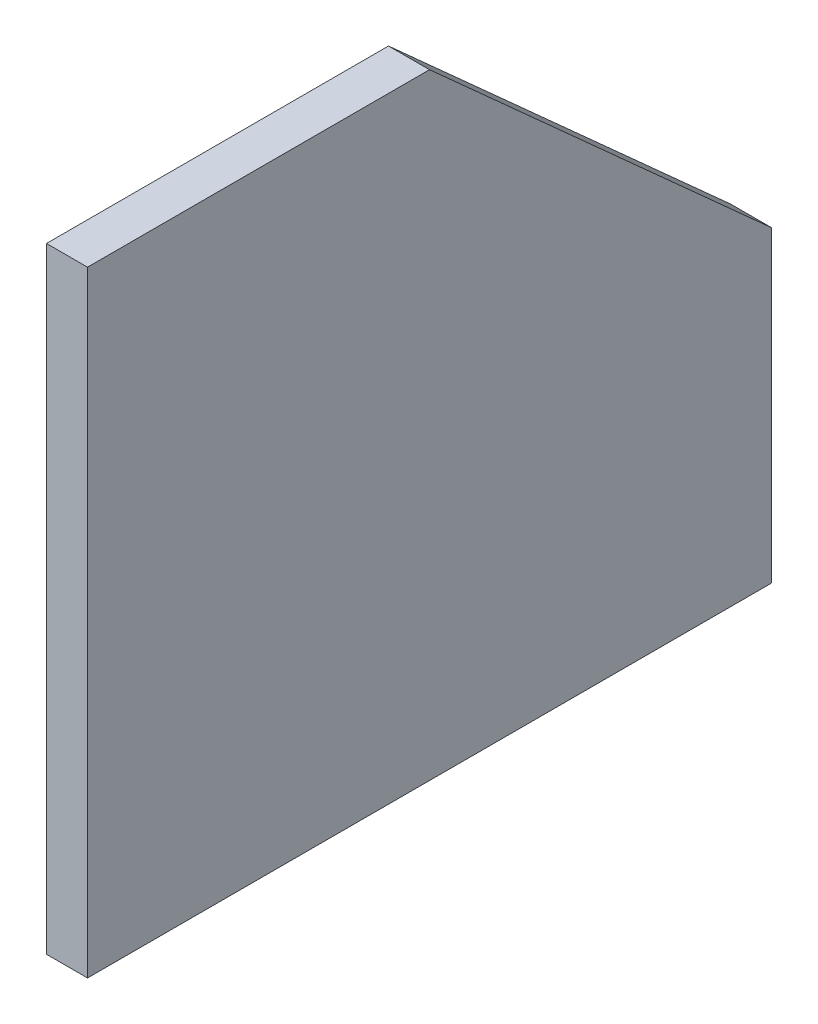
ISO-10303-21;
HEADER;
FILE_DESCRIPTION(('STEP AP214'),'2;1');
FILE_NAME('part.step','',(''),(''),'','','');
FILE_SCHEMA(('AUTOMOTIVE_DESIGN { 1 0 10303 214 1 1 1 1 }'));
ENDSEC;
DATA;
#1=APPLICATION_CONTEXT('core data for automotive mechanical design processes');
#2=APPLICATION_PROTOCOL_DEFINITION('international standard','automotive_design',2000,#1);
#3=PRODUCT_CONTEXT('',#1,'mechanical');
#4=PRODUCT('Part','Part','',(#3));
#5=PRODUCT_RELATED_PRODUCT_CATEGORY('part','',(#4));
#6=PRODUCT_DEFINITION_FORMATION('','',#4);
#7=PRODUCT_DEFINITION_CONTEXT('part definition',#1,'design');
#8=PRODUCT_DEFINITION('design','',#6,#7);
#9=PRODUCT_DEFINITION_SHAPE('','',#8);
#10=(LENGTH_UNIT() NAMED_UNIT(*) SI_UNIT(.MILLI.,.METRE.));
#11=(NAMED_UNIT(*) PLANE_ANGLE_UNIT() SI_UNIT($,.RADIAN.));
#12=(NAMED_UNIT(*) SI_UNIT($,.STERADIAN.) SOLID_ANGLE_UNIT());
#13=UNCERTAINTY_MEASURE_WITH_UNIT(LENGTH_MEASURE(1.E-05),#10,'distance_accuracy_value','');
#14=(GEOMETRIC_REPRESENTATION_CONTEXT(3) GLOBAL_UNCERTAINTY_ASSIGNED_CONTEXT((#13)) GLOBAL_UNIT_ASSIGNED_CONTEXT((#10,
#11,#12)) REPRESENTATION_CONTEXT('',''));
#15=CARTESIAN_POINT('',(0.,0.,0.));
#16=DIRECTION('',(0.,0.,1.));
#17=DIRECTION('',(1.,0.,0.));
#18=AXIS2_PLACEMENT_3D('',#15,#16,#17);
#19=CARTESIAN_POINT('',(-6.,0.,0.));
#20=DIRECTION('',(0.,0.,-1.));
#21=DIRECTION('',(0.,1.,0.));
#22=AXIS2_PLACEMENT_3D('',#19,#20,#21);
#23=PLANE('',#22);
#24=DIRECTION('',(0.,1.,0.));
#25=VECTOR('',#24,1.);
#26=CARTESIAN_POINT('',(0.,0.,0.));
#27=LINE('',#26,#25);
#28=CARTESIAN_POINT('',(0.,0.,0.));
#29=VERTEX_POINT('',#28);
#30=CARTESIAN_POINT('',(0.,45.,0.));
#31=VERTEX_POINT('',#30);
#32=EDGE_CURVE('E115',#29,#31,#27,.T.);
#33=ORIENTED_EDGE('',*,*,#32,.F.);
#34=DIRECTION('',(1.,0.,0.));
#35=VECTOR('',#34,1.);
#36=CARTESIAN_POINT('',(-6.,0.,0.));
#37=LINE('',#36,#35);
#38=CARTESIAN_POINT('',(-6.,0.,0.));
#39=VERTEX_POINT('',#38);
#40=EDGE_CURVE('E11',#39,#29,#37,.T.);
#41=ORIENTED_EDGE('',*,*,#40,.F.);
#42=DIRECTION('',(0.,1.,0.));
#43=VECTOR('',#42,1.);
#44=CARTESIAN_POINT('',(-6.,0.,0.));
#45=LINE('',#44,#43);
#46=CARTESIAN_POINT('',(-6.,45.,0.));
#47=VERTEX_POINT('',#46);
#48=EDGE_CURVE('E110',#39,#47,#45,.T.);
#49=ORIENTED_EDGE('',*,*,#48,.T.);
#50=DIRECTION('',(1.,0.,0.));
#51=VECTOR('',#50,1.);
#52=CARTESIAN_POINT('',(-6.,45.,0.));
#53=LINE('',#52,#51);
#54=EDGE_CURVE('E41',#47,#31,#53,.T.);
#55=ORIENTED_EDGE('',*,*,#54,.T.);
#56=EDGE_LOOP('',(#33,#41,#49,#55));
#57=FACE_BOUND('',#56,.T.);
#58=ADVANCED_FACE('F38',(#57),#23,.T.);
#59=CARTESIAN_POINT('',(-6.,0.,0.));
#60=DIRECTION('',(0.,-1.,0.));
#61=DIRECTION('',(0.,0.,-1.));
#62=AXIS2_PLACEMENT_3D('',#59,#60,#61);
#63=PLANE('',#62);
#64=DIRECTION('',(0.,0.,-1.));
#65=VECTOR('',#64,1.);
#66=CARTESIAN_POINT('',(0.,0.,0.));
#67=LINE('',#66,#65);
#68=CARTESIAN_POINT('',(0.,0.,100.));
#69=VERTEX_POINT('',#68);
#70=EDGE_CURVE('E124',#69,#29,#67,.T.);
#71=ORIENTED_EDGE('',*,*,#70,.F.);
#72=DIRECTION('',(1.,0.,0.));
#73=VECTOR('',#72,1.);
#74=CARTESIAN_POINT('',(-6.,0.,100.));
#75=LINE('',#74,#73);
#76=CARTESIAN_POINT('',(-6.,0.,100.));
#77=VERTEX_POINT('',#76);
#78=EDGE_CURVE('E47',#77,#69,#75,.T.);
#79=ORIENTED_EDGE('',*,*,#78,.F.);
#80=DIRECTION('',(0.,0.,-1.));
#81=VECTOR('',#80,1.);
#82=CARTESIAN_POINT('',(-6.,0.,0.));
#83=LINE('',#82,#81);
#84=EDGE_CURVE('E105',#77,#39,#83,.T.);
#85=ORIENTED_EDGE('',*,*,#84,.T.);
#86=ORIENTED_EDGE('',*,*,#40,.T.);
#87=EDGE_LOOP('',(#71,#79,#85,#86));
#88=FACE_BOUND('',#87,.T.);
#89=ADVANCED_FACE('F130',(#88),#63,.T.);
#90=CARTESIAN_POINT('',(-6.,0.,100.));
#91=DIRECTION('',(0.,0.,1.));
#92=DIRECTION('',(1.,0.,0.));
#93=AXIS2_PLACEMENT_3D('',#90,#91,#92);
#94=PLANE('',#93);
#95=DIRECTION('',(0.,-1.,0.));
#96=VECTOR('',#95,1.);
#97=CARTESIAN_POINT('',(0.,0.,100.));
#98=LINE('',#97,#96);
#99=CARTESIAN_POINT('',(0.,90.,100.));
#100=VERTEX_POINT('',#99);
#101=EDGE_CURVE('E94',#100,#69,#98,.T.);
#102=ORIENTED_EDGE('',*,*,#101,.F.);
#103=DIRECTION('',(1.,0.,0.));
#104=VECTOR('',#103,1.);
#105=CARTESIAN_POINT('',(-6.,90.,100.));
#106=LINE('',#105,#104);
#107=CARTESIAN_POINT('',(-6.,90.,100.));
#108=VERTEX_POINT('',#107);
#109=EDGE_CURVE('E89',#108,#100,#106,.T.);
#110=ORIENTED_EDGE('',*,*,#109,.F.);
#111=DIRECTION('',(0.,-1.,0.));
#112=VECTOR('',#111,1.);
#113=CARTESIAN_POINT('',(-6.,0.,100.));
#114=LINE('',#113,#112);
#115=EDGE_CURVE('E92',#108,#77,#114,.T.);
#116=ORIENTED_EDGE('',*,*,#115,.T.);
#117=ORIENTED_EDGE('',*,*,#78,.T.);
#118=EDGE_LOOP('',(#102,#110,#116,#117));
#119=FACE_BOUND('',#118,.T.);
#120=ADVANCED_FACE('F91',(#119),#94,.T.);
#121=CARTESIAN_POINT('',(-6.,90.,50.));
#122=DIRECTION('',(0.,1.,0.));
#123=DIRECTION('',(0.,0.,1.));
#124=AXIS2_PLACEMENT_3D('',#121,#122,#123);
#125=PLANE('',#124);
#126=DIRECTION('',(0.,0.,1.));
#127=VECTOR('',#126,1.);
#128=CARTESIAN_POINT('',(0.,90.,50.));
#129=LINE('',#128,#127);
#130=CARTESIAN_POINT('',(0.,90.,50.));
#131=VERTEX_POINT('',#130);
#132=EDGE_CURVE('E121',#131,#100,#129,.T.);
#133=ORIENTED_EDGE('',*,*,#132,.F.);
#134=DIRECTION('',(1.,0.,0.));
#135=VECTOR('',#134,1.);
#136=CARTESIAN_POINT('',(-6.,90.,50.));
#137=LINE('',#136,#135);
#138=CARTESIAN_POINT('',(-6.,90.,50.));
#139=VERTEX_POINT('',#138);
#140=EDGE_CURVE('E99',#139,#131,#137,.T.);
#141=ORIENTED_EDGE('',*,*,#140,.F.);
#142=DIRECTION('',(0.,0.,1.));
#143=VECTOR('',#142,1.);
#144=CARTESIAN_POINT('',(-6.,90.,50.));
#145=LINE('',#144,#143);
#146=EDGE_CURVE('E104',#139,#108,#145,.T.);
#147=ORIENTED_EDGE('',*,*,#146,.T.);
#148=ORIENTED_EDGE('',*,*,#109,.T.);
#149=EDGE_LOOP('',(#133,#141,#147,#148));
#150=FACE_BOUND('',#149,.T.);
#151=ADVANCED_FACE('F107',(#150),#125,.T.);
#152=CARTESIAN_POINT('',(-6.,90.,50.));
#153=DIRECTION('',(0.,0.743294146247166,-0.66896473162245));
#154=DIRECTION('',(0.,0.66896473162245,0.743294146247166));
#155=AXIS2_PLACEMENT_3D('',#152,#153,#154);
#156=PLANE('',#155);
#157=DIRECTION('',(0.,0.66896473162245,0.743294146247166));
#158=VECTOR('',#157,1.);
#159=CARTESIAN_POINT('',(0.,90.,50.));
#160=LINE('',#159,#158);
#161=EDGE_CURVE('E118',#31,#131,#160,.T.);
#162=ORIENTED_EDGE('',*,*,#161,.F.);
#163=ORIENTED_EDGE('',*,*,#54,.F.);
#164=DIRECTION('',(0.,0.66896473162245,0.743294146247166));
#165=VECTOR('',#164,1.);
#166=CARTESIAN_POINT('',(-6.,90.,50.));
#167=LINE('',#166,#165);
#168=EDGE_CURVE('E108',#47,#139,#167,.T.);
#169=ORIENTED_EDGE('',*,*,#168,.T.);
#170=ORIENTED_EDGE('',*,*,#140,.T.);
#171=EDGE_LOOP('',(#162,#163,#169,#170));
#172=FACE_BOUND('',#171,.T.);
#173=ADVANCED_FACE('F127',(#172),#156,.T.);
#174=CARTESIAN_POINT('',(-6.,0.,0.));
#175=DIRECTION('',(1.,0.,0.));
#176=DIRECTION('',(0.,0.,-1.));
#177=AXIS2_PLACEMENT_3D('',#174,#175,#176);
#178=PLANE('',#177);
#179=ORIENTED_EDGE('',*,*,#48,.F.);
#180=ORIENTED_EDGE('',*,*,#84,.F.);
#181=ORIENTED_EDGE('',*,*,#115,.F.);
#182=ORIENTED_EDGE('',*,*,#146,.F.);
#183=ORIENTED_EDGE('',*,*,#168,.F.);
#184=EDGE_LOOP('',(#179,#180,#181,#182,#183));
#185=FACE_BOUND('',#184,.T.);
#186=ADVANCED_FACE('F103',(#185),#178,.F.);
#187=CARTESIAN_POINT('',(0.,0.,0.));
#188=DIRECTION('',(1.,0.,0.));
#189=DIRECTION('',(0.,0.,-1.));
#190=AXIS2_PLACEMENT_3D('',#187,#188,#189);
#191=PLANE('',#190);
#192=ORIENTED_EDGE('',*,*,#32,.T.);
#193=ORIENTED_EDGE('',*,*,#161,.T.);
#194=ORIENTED_EDGE('',*,*,#132,.T.);
#195=ORIENTED_EDGE('',*,*,#101,.T.);
#196=ORIENTED_EDGE('',*,*,#70,.T.);
#197=EDGE_LOOP('',(#192,#193,#194,#195,#196));
#198=FACE_BOUND('',#197,.T.);
#199=ADVANCED_FACE('F129',(#198),#191,.T.);
#200=CLOSED_SHELL('',(#58,#89,#120,#151,#173,#186,#199));
#201=MANIFOLD_SOLID_BREP('B2',#200);
#202=ADVANCED_BREP_SHAPE_REPRESENTATION('',(#18,#201),#14);
#203=SHAPE_DEFINITION_REPRESENTATION(#9,#202);
ENDSEC;
END-ISO-10303-21;
